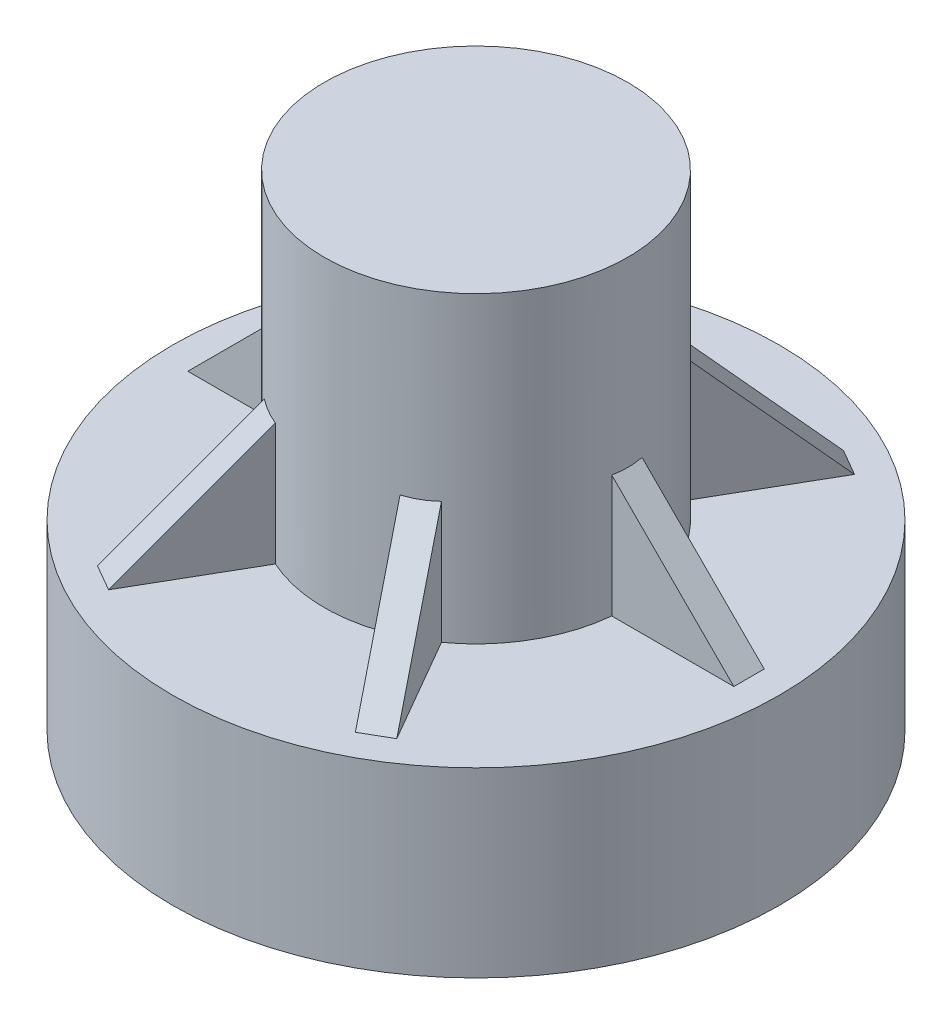
ISO-10303-21;
HEADER;
FILE_DESCRIPTION(('STEP AP214'),'2;1');
FILE_NAME('part.step','',(''),(''),'','','');
FILE_SCHEMA(('AUTOMOTIVE_DESIGN { 1 0 10303 214 1 1 1 1 }'));
ENDSEC;
DATA;
#1=APPLICATION_CONTEXT('core data for automotive mechanical design processes');
#2=APPLICATION_PROTOCOL_DEFINITION('international standard','automotive_design',2000,#1);
#3=PRODUCT_CONTEXT('',#1,'mechanical');
#4=PRODUCT('Part','Part','',(#3));
#5=PRODUCT_RELATED_PRODUCT_CATEGORY('part','',(#4));
#6=PRODUCT_DEFINITION_FORMATION('','',#4);
#7=PRODUCT_DEFINITION_CONTEXT('part definition',#1,'design');
#8=PRODUCT_DEFINITION('design','',#6,#7);
#9=PRODUCT_DEFINITION_SHAPE('','',#8);
#10=(LENGTH_UNIT() NAMED_UNIT(*) SI_UNIT(.MILLI.,.METRE.));
#11=(NAMED_UNIT(*) PLANE_ANGLE_UNIT() SI_UNIT($,.RADIAN.));
#12=(NAMED_UNIT(*) SI_UNIT($,.STERADIAN.) SOLID_ANGLE_UNIT());
#13=UNCERTAINTY_MEASURE_WITH_UNIT(LENGTH_MEASURE(1.E-05),#10,'distance_accuracy_value','');
#14=(GEOMETRIC_REPRESENTATION_CONTEXT(3) GLOBAL_UNCERTAINTY_ASSIGNED_CONTEXT((#13)) GLOBAL_UNIT_ASSIGNED_CONTEXT((#10,
#11,#12)) REPRESENTATION_CONTEXT('',''));
#15=CARTESIAN_POINT('',(0.,0.,0.));
#16=DIRECTION('',(0.,0.,1.));
#17=DIRECTION('',(1.,0.,0.));
#18=AXIS2_PLACEMENT_3D('',#15,#16,#17);
#19=CARTESIAN_POINT('',(24.9051040037769,73.20555272017,43.3012701892216));
#20=DIRECTION('',(-0.353553390593279,-0.707106781186551,-0.612372435695787));
#21=DIRECTION('',(0.353553390593283,-0.707106781186544,0.612372435695794));
#22=AXIS2_PLACEMENT_3D('',#19,#20,#21);
#23=PLANE('',#22);
#24=DIRECTION('',(0.353553390593283,-0.707106781186544,0.612372435695794));
#25=VECTOR('',#24,1.);
#26=CARTESIAN_POINT('',(20.5749769848547,73.20555272017,45.8012701892217));
#27=LINE('',#26,#25);
#28=CARTESIAN_POINT('',(20.4496629125202,73.4561808648391,45.584219849035));
#29=VERTEX_POINT('',#28);
#30=CARTESIAN_POINT('',(40.5749769848554,33.20555272017,80.4422863405994));
#31=VERTEX_POINT('',#30);
#32=EDGE_CURVE('E343',#29,#31,#27,.T.);
#33=ORIENTED_EDGE('',*,*,#32,.T.);
#34=DIRECTION('',(-0.866025403784433,0.,0.50000000000001));
#35=VECTOR('',#34,1.);
#36=CARTESIAN_POINT('',(44.9051040037775,33.20555272017,77.9422863405994));
#37=LINE('',#36,#35);
#38=CARTESIAN_POINT('',(49.2352310226997,33.20555272017,75.4422863405993));
#39=VERTEX_POINT('',#38);
#40=EDGE_CURVE('E47',#31,#39,#37,.F.);
#41=ORIENTED_EDGE('',*,*,#40,.T.);
#42=DIRECTION('',(0.353553390593283,-0.707106781186544,0.612372435695794));
#43=VECTOR('',#42,1.);
#44=CARTESIAN_POINT('',(29.235231022699,73.20555272017,40.8012701892216));
#45=LINE('',#44,#43);
#46=CARTESIAN_POINT('',(29.1099169503645,73.456180864839,40.5842198490349));
#47=VERTEX_POINT('',#46);
#48=EDGE_CURVE('E351',#47,#39,#45,.T.);
#49=ORIENTED_EDGE('',*,*,#48,.F.);
#50=CARTESIAN_POINT('',(-0.0948959962236216,123.20555272017,0.));
#51=DIRECTION('',(-0.353553390593279,-0.707106781186551,-0.612372435695787));
#52=DIRECTION('',(0.353553390593283,-0.707106781186544,0.612372435695794));
#53=AXIS2_PLACEMENT_3D('',#50,#51,#52);
#54=ELLIPSE('',#53,70.7106781186544,50.);
#55=EDGE_CURVE('E11',#29,#47,#54,.F.);
#56=ORIENTED_EDGE('',*,*,#55,.F.);
#57=EDGE_LOOP('',(#33,#41,#49,#56));
#58=FACE_BOUND('',#57,.T.);
#59=ADVANCED_FACE('F39',(#58),#23,.F.);
#60=CARTESIAN_POINT('',(4.23523102269854,53.20555272017,-2.50000000000005));
#61=DIRECTION('',(-0.866025403784433,0.,0.50000000000001));
#62=DIRECTION('',(0.50000000000001,0.,0.866025403784433));
#63=AXIS2_PLACEMENT_3D('',#60,#61,#62);
#64=PLANE('',#63);
#65=DIRECTION('',(0.50000000000001,0.,0.866025403784433));
#66=VECTOR('',#65,1.);
#67=CARTESIAN_POINT('',(4.23523102269854,33.20555272017,-2.50000000000005));
#68=LINE('',#67,#66);
#69=CARTESIAN_POINT('',(29.1099169503645,33.20555272017,40.5842198490349));
#70=VERTEX_POINT('',#69);
#71=EDGE_CURVE('E54',#70,#39,#68,.T.);
#72=ORIENTED_EDGE('',*,*,#71,.F.);
#73=DIRECTION('',(0.,-1.,0.));
#74=VECTOR('',#73,1.);
#75=CARTESIAN_POINT('',(29.1099169503645,133.20555272017,40.5842198490349));
#76=LINE('',#75,#74);
#77=EDGE_CURVE('E60',#70,#47,#76,.F.);
#78=ORIENTED_EDGE('',*,*,#77,.T.);
#79=ORIENTED_EDGE('',*,*,#48,.T.);
#80=EDGE_LOOP('',(#72,#78,#79));
#81=FACE_BOUND('',#80,.T.);
#82=ADVANCED_FACE('F382',(#81),#64,.F.);
#83=CARTESIAN_POINT('',(-4.42502301514579,53.20555272017,2.50000000000005));
#84=DIRECTION('',(-0.866025403784433,0.,0.50000000000001));
#85=DIRECTION('',(0.50000000000001,0.,0.866025403784433));
#86=AXIS2_PLACEMENT_3D('',#83,#84,#85);
#87=PLANE('',#86);
#88=DIRECTION('',(0.,-1.,0.));
#89=VECTOR('',#88,1.);
#90=CARTESIAN_POINT('',(20.4496629125202,133.20555272017,45.584219849035));
#91=LINE('',#90,#89);
#92=CARTESIAN_POINT('',(20.4496629125202,33.20555272017,45.584219849035));
#93=VERTEX_POINT('',#92);
#94=EDGE_CURVE('E337',#93,#29,#91,.F.);
#95=ORIENTED_EDGE('',*,*,#94,.F.);
#96=DIRECTION('',(0.50000000000001,0.,0.866025403784433));
#97=VECTOR('',#96,1.);
#98=CARTESIAN_POINT('',(-4.42502301514579,33.20555272017,2.50000000000005));
#99=LINE('',#98,#97);
#100=EDGE_CURVE('E340',#93,#31,#99,.T.);
#101=ORIENTED_EDGE('',*,*,#100,.T.);
#102=ORIENTED_EDGE('',*,*,#32,.F.);
#103=EDGE_LOOP('',(#95,#101,#102));
#104=FACE_BOUND('',#103,.T.);
#105=ADVANCED_FACE('F364',(#104),#87,.T.);
#106=CARTESIAN_POINT('',(-25.0948959962232,73.20555272017,43.3012701892222));
#107=DIRECTION('',(0.353553390593266,-0.707106781186551,-0.612372435695794));
#108=DIRECTION('',(-0.35355339059327,-0.707106781186544,0.612372435695801));
#109=AXIS2_PLACEMENT_3D('',#106,#107,#108);
#110=PLANE('',#109);
#111=DIRECTION('',(-0.35355339059327,-0.707106781186544,0.612372435695801));
#112=VECTOR('',#111,1.);
#113=CARTESIAN_POINT('',(-29.4250230151454,73.20555272017,40.8012701892222));
#114=LINE('',#113,#112);
#115=CARTESIAN_POINT('',(-29.2997089428109,73.4561808648391,40.5842198490355));
#116=VERTEX_POINT('',#115);
#117=CARTESIAN_POINT('',(-49.4250230151453,33.20555272017,75.4422863406003));
#118=VERTEX_POINT('',#117);
#119=EDGE_CURVE('E315',#116,#118,#114,.T.);
#120=ORIENTED_EDGE('',*,*,#119,.T.);
#121=DIRECTION('',(-0.866025403784443,0.,-0.499999999999992));
#122=VECTOR('',#121,1.);
#123=CARTESIAN_POINT('',(-45.0948959962231,33.20555272017,77.9422863406003));
#124=LINE('',#123,#122);
#125=CARTESIAN_POINT('',(-40.7647689773009,33.20555272017,80.4422863406003));
#126=VERTEX_POINT('',#125);
#127=EDGE_CURVE('E329',#118,#126,#124,.F.);
#128=ORIENTED_EDGE('',*,*,#127,.T.);
#129=DIRECTION('',(-0.35355339059327,-0.707106781186544,0.612372435695801));
#130=VECTOR('',#129,1.);
#131=CARTESIAN_POINT('',(-20.764768977301,73.20555272017,45.8012701892221));
#132=LINE('',#131,#130);
#133=CARTESIAN_POINT('',(-20.6394549049665,73.456180864839,45.5842198490354));
#134=VERTEX_POINT('',#133);
#135=EDGE_CURVE('E325',#134,#126,#132,.T.);
#136=ORIENTED_EDGE('',*,*,#135,.F.);
#137=CARTESIAN_POINT('',(-0.0948959962236216,123.20555272017,0.));
#138=DIRECTION('',(0.353553390593266,-0.707106781186551,-0.612372435695794));
#139=DIRECTION('',(-0.35355339059327,-0.707106781186544,0.612372435695801));
#140=AXIS2_PLACEMENT_3D('',#137,#138,#139);
#141=ELLIPSE('',#140,70.7106781186544,50.);
#142=EDGE_CURVE('E333',#116,#134,#141,.F.);
#143=ORIENTED_EDGE('',*,*,#142,.F.);
#144=EDGE_LOOP('',(#120,#128,#136,#143));
#145=FACE_BOUND('',#144,.T.);
#146=ADVANCED_FACE('F389',(#145),#110,.F.);
#147=CARTESIAN_POINT('',(4.23523102269859,53.20555272017,2.49999999999996));
#148=DIRECTION('',(-0.866025403784443,0.,-0.499999999999992));
#149=DIRECTION('',(-0.499999999999992,0.,0.866025403784443));
#150=AXIS2_PLACEMENT_3D('',#147,#148,#149);
#151=PLANE('',#150);
#152=DIRECTION('',(-0.499999999999992,0.,0.866025403784443));
#153=VECTOR('',#152,1.);
#154=CARTESIAN_POINT('',(4.23523102269859,33.20555272017,2.49999999999996));
#155=LINE('',#154,#153);
#156=CARTESIAN_POINT('',(-20.6394549049665,33.20555272017,45.5842198490354));
#157=VERTEX_POINT('',#156);
#158=EDGE_CURVE('E319',#157,#126,#155,.T.);
#159=ORIENTED_EDGE('',*,*,#158,.F.);
#160=DIRECTION('',(0.,-1.,0.));
#161=VECTOR('',#160,1.);
#162=CARTESIAN_POINT('',(-20.6394549049665,133.20555272017,45.5842198490354));
#163=LINE('',#162,#161);
#164=EDGE_CURVE('E322',#157,#134,#163,.F.);
#165=ORIENTED_EDGE('',*,*,#164,.T.);
#166=ORIENTED_EDGE('',*,*,#135,.T.);
#167=EDGE_LOOP('',(#159,#165,#166));
#168=FACE_BOUND('',#167,.T.);
#169=ADVANCED_FACE('F394',(#168),#151,.F.);
#170=CARTESIAN_POINT('',(-4.42502301514584,53.20555272017,-2.49999999999996));
#171=DIRECTION('',(-0.866025403784443,0.,-0.499999999999992));
#172=DIRECTION('',(-0.499999999999992,0.,0.866025403784443));
#173=AXIS2_PLACEMENT_3D('',#170,#171,#172);
#174=PLANE('',#173);
#175=DIRECTION('',(0.,-1.,0.));
#176=VECTOR('',#175,1.);
#177=CARTESIAN_POINT('',(-29.2997089428109,133.20555272017,40.5842198490355));
#178=LINE('',#177,#176);
#179=CARTESIAN_POINT('',(-29.2997089428109,33.20555272017,40.5842198490355));
#180=VERTEX_POINT('',#179);
#181=EDGE_CURVE('E309',#180,#116,#178,.F.);
#182=ORIENTED_EDGE('',*,*,#181,.F.);
#183=DIRECTION('',(-0.499999999999992,0.,0.866025403784443));
#184=VECTOR('',#183,1.);
#185=CARTESIAN_POINT('',(-4.42502301514584,33.20555272017,-2.49999999999996));
#186=LINE('',#185,#184);
#187=EDGE_CURVE('E312',#180,#118,#186,.T.);
#188=ORIENTED_EDGE('',*,*,#187,.T.);
#189=ORIENTED_EDGE('',*,*,#119,.F.);
#190=EDGE_LOOP('',(#182,#188,#189));
#191=FACE_BOUND('',#190,.T.);
#192=ADVANCED_FACE('F398',(#191),#174,.T.);
#193=CARTESIAN_POINT('',(-50.0948959962236,73.20555272017,0.));
#194=DIRECTION('',(0.707106781186544,-0.707106781186551,0.));
#195=DIRECTION('',(-0.707106781186551,-0.707106781186544,0.));
#196=AXIS2_PLACEMENT_3D('',#193,#194,#195);
#197=PLANE('',#196);
#198=DIRECTION('',(-0.707106781186551,-0.707106781186544,0.));
#199=VECTOR('',#198,1.);
#200=CARTESIAN_POINT('',(-50.0948959962236,73.20555272017,-5.));
#201=LINE('',#200,#199);
#202=CARTESIAN_POINT('',(-49.8442678515546,73.4561808648391,-5.));
#203=VERTEX_POINT('',#202);
#204=CARTESIAN_POINT('',(-90.0948959962241,33.20555272017,-5.));
#205=VERTEX_POINT('',#204);
#206=EDGE_CURVE('E286',#203,#205,#201,.T.);
#207=ORIENTED_EDGE('',*,*,#206,.T.);
#208=DIRECTION('',(0.,0.,-1.));
#209=VECTOR('',#208,1.);
#210=CARTESIAN_POINT('',(-90.0948959962241,33.20555272017,0.));
#211=LINE('',#210,#209);
#212=CARTESIAN_POINT('',(-90.0948959962241,33.20555272017,5.));
#213=VERTEX_POINT('',#212);
#214=EDGE_CURVE('E300',#205,#213,#211,.F.);
#215=ORIENTED_EDGE('',*,*,#214,.T.);
#216=DIRECTION('',(-0.707106781186551,-0.707106781186544,0.));
#217=VECTOR('',#216,1.);
#218=CARTESIAN_POINT('',(-50.0948959962236,73.20555272017,5.));
#219=LINE('',#218,#217);
#220=CARTESIAN_POINT('',(-49.8442678515546,73.456180864839,5.));
#221=VERTEX_POINT('',#220);
#222=EDGE_CURVE('E296',#221,#213,#219,.T.);
#223=ORIENTED_EDGE('',*,*,#222,.F.);
#224=CARTESIAN_POINT('',(-0.0948959962236216,123.20555272017,0.));
#225=DIRECTION('',(0.707106781186544,-0.707106781186551,0.));
#226=DIRECTION('',(-0.707106781186551,-0.707106781186544,0.));
#227=AXIS2_PLACEMENT_3D('',#224,#225,#226);
#228=ELLIPSE('',#227,70.7106781186544,50.);
#229=EDGE_CURVE('E304',#203,#221,#228,.F.);
#230=ORIENTED_EDGE('',*,*,#229,.F.);
#231=EDGE_LOOP('',(#207,#215,#223,#230));
#232=FACE_BOUND('',#231,.T.);
#233=ADVANCED_FACE('F402',(#232),#197,.F.);
#234=CARTESIAN_POINT('',(-0.0948959962236216,53.20555272017,5.));
#235=DIRECTION('',(0.,0.,-1.));
#236=DIRECTION('',(-1.,0.,0.));
#237=AXIS2_PLACEMENT_3D('',#234,#235,#236);
#238=PLANE('',#237);
#239=DIRECTION('',(-1.,0.,0.));
#240=VECTOR('',#239,1.);
#241=CARTESIAN_POINT('',(-0.0948959962236216,33.20555272017,5.));
#242=LINE('',#241,#240);
#243=CARTESIAN_POINT('',(-49.8442678515546,33.20555272017,5.));
#244=VERTEX_POINT('',#243);
#245=EDGE_CURVE('E290',#244,#213,#242,.T.);
#246=ORIENTED_EDGE('',*,*,#245,.F.);
#247=DIRECTION('',(0.,-1.,0.));
#248=VECTOR('',#247,1.);
#249=CARTESIAN_POINT('',(-49.8442678515546,133.20555272017,5.));
#250=LINE('',#249,#248);
#251=EDGE_CURVE('E293',#244,#221,#250,.F.);
#252=ORIENTED_EDGE('',*,*,#251,.T.);
#253=ORIENTED_EDGE('',*,*,#222,.T.);
#254=EDGE_LOOP('',(#246,#252,#253));
#255=FACE_BOUND('',#254,.T.);
#256=ADVANCED_FACE('F406',(#255),#238,.F.);
#257=CARTESIAN_POINT('',(-0.0948959962236216,53.20555272017,-5.));
#258=DIRECTION('',(0.,0.,-1.));
#259=DIRECTION('',(-1.,0.,0.));
#260=AXIS2_PLACEMENT_3D('',#257,#258,#259);
#261=PLANE('',#260);
#262=DIRECTION('',(0.,-1.,0.));
#263=VECTOR('',#262,1.);
#264=CARTESIAN_POINT('',(-49.8442678515546,133.20555272017,-5.));
#265=LINE('',#264,#263);
#266=CARTESIAN_POINT('',(-49.8442678515546,33.20555272017,-5.));
#267=VERTEX_POINT('',#266);
#268=EDGE_CURVE('E280',#267,#203,#265,.F.);
#269=ORIENTED_EDGE('',*,*,#268,.F.);
#270=DIRECTION('',(-1.,0.,0.));
#271=VECTOR('',#270,1.);
#272=CARTESIAN_POINT('',(-0.0948959962236216,33.20555272017,-5.));
#273=LINE('',#272,#271);
#274=EDGE_CURVE('E283',#267,#205,#273,.T.);
#275=ORIENTED_EDGE('',*,*,#274,.T.);
#276=ORIENTED_EDGE('',*,*,#206,.F.);
#277=EDGE_LOOP('',(#269,#275,#276));
#278=FACE_BOUND('',#277,.T.);
#279=ADVANCED_FACE('F410',(#278),#261,.T.);
#280=CARTESIAN_POINT('',(-25.0948959962238,73.20555272017,-43.3012701892218));
#281=DIRECTION('',(0.353553390593275,-0.707106781186551,0.61237243569579));
#282=DIRECTION('',(-0.353553390593279,-0.707106781186544,-0.612372435695796));
#283=AXIS2_PLACEMENT_3D('',#280,#281,#282);
#284=PLANE('',#283);
#285=DIRECTION('',(-0.353553390593279,-0.707106781186544,-0.612372435695796));
#286=VECTOR('',#285,1.);
#287=CARTESIAN_POINT('',(-20.7647689773016,73.20555272017,-45.8012701892219));
#288=LINE('',#287,#286);
#289=CARTESIAN_POINT('',(-20.6394549049671,73.4561808648391,-45.5842198490351));
#290=VERTEX_POINT('',#289);
#291=CARTESIAN_POINT('',(-40.764768977302,33.20555272017,-80.4422863405997));
#292=VERTEX_POINT('',#291);
#293=EDGE_CURVE('E257',#290,#292,#288,.T.);
#294=ORIENTED_EDGE('',*,*,#293,.T.);
#295=DIRECTION('',(0.866025403784436,0.,-0.500000000000004));
#296=VECTOR('',#295,1.);
#297=CARTESIAN_POINT('',(-45.0948959962242,33.20555272017,-77.9422863405997));
#298=LINE('',#297,#296);
#299=CARTESIAN_POINT('',(-49.4250230151464,33.20555272017,-75.4422863405997));
#300=VERTEX_POINT('',#299);
#301=EDGE_CURVE('E271',#292,#300,#298,.F.);
#302=ORIENTED_EDGE('',*,*,#301,.T.);
#303=DIRECTION('',(-0.353553390593279,-0.707106781186544,-0.612372435695796));
#304=VECTOR('',#303,1.);
#305=CARTESIAN_POINT('',(-29.425023015146,73.20555272017,-40.8012701892218));
#306=LINE('',#305,#304);
#307=CARTESIAN_POINT('',(-29.2997089428115,73.456180864839,-40.5842198490351));
#308=VERTEX_POINT('',#307);
#309=EDGE_CURVE('E267',#308,#300,#306,.T.);
#310=ORIENTED_EDGE('',*,*,#309,.F.);
#311=CARTESIAN_POINT('',(-0.0948959962236216,123.20555272017,0.));
#312=DIRECTION('',(0.353553390593275,-0.707106781186551,0.61237243569579));
#313=DIRECTION('',(-0.353553390593279,-0.707106781186544,-0.612372435695796));
#314=AXIS2_PLACEMENT_3D('',#311,#312,#313);
#315=ELLIPSE('',#314,70.7106781186544,50.);
#316=EDGE_CURVE('E275',#290,#308,#315,.F.);
#317=ORIENTED_EDGE('',*,*,#316,.F.);
#318=EDGE_LOOP('',(#294,#302,#310,#317));
#319=FACE_BOUND('',#318,.T.);
#320=ADVANCED_FACE('F414',(#319),#284,.F.);
#321=CARTESIAN_POINT('',(-4.4250230151458,53.20555272017,2.50000000000002));
#322=DIRECTION('',(0.866025403784436,0.,-0.500000000000004));
#323=DIRECTION('',(-0.500000000000004,0.,-0.866025403784436));
#324=AXIS2_PLACEMENT_3D('',#321,#322,#323);
#325=PLANE('',#324);
#326=DIRECTION('',(-0.500000000000004,0.,-0.866025403784436));
#327=VECTOR('',#326,1.);
#328=CARTESIAN_POINT('',(-4.4250230151458,33.20555272017,2.50000000000002));
#329=LINE('',#328,#327);
#330=CARTESIAN_POINT('',(-29.2997089428115,33.20555272017,-40.5842198490351));
#331=VERTEX_POINT('',#330);
#332=EDGE_CURVE('E261',#331,#300,#329,.T.);
#333=ORIENTED_EDGE('',*,*,#332,.F.);
#334=DIRECTION('',(0.,-1.,0.));
#335=VECTOR('',#334,1.);
#336=CARTESIAN_POINT('',(-29.2997089428115,133.20555272017,-40.5842198490351));
#337=LINE('',#336,#335);
#338=EDGE_CURVE('E264',#331,#308,#337,.F.);
#339=ORIENTED_EDGE('',*,*,#338,.T.);
#340=ORIENTED_EDGE('',*,*,#309,.T.);
#341=EDGE_LOOP('',(#333,#339,#340));
#342=FACE_BOUND('',#341,.T.);
#343=ADVANCED_FACE('F418',(#342),#325,.F.);
#344=CARTESIAN_POINT('',(4.23523102269856,53.20555272017,-2.50000000000002));
#345=DIRECTION('',(0.866025403784436,0.,-0.500000000000004));
#346=DIRECTION('',(-0.500000000000004,0.,-0.866025403784436));
#347=AXIS2_PLACEMENT_3D('',#344,#345,#346);
#348=PLANE('',#347);
#349=DIRECTION('',(0.,-1.,0.));
#350=VECTOR('',#349,1.);
#351=CARTESIAN_POINT('',(-20.6394549049671,133.20555272017,-45.5842198490351));
#352=LINE('',#351,#350);
#353=CARTESIAN_POINT('',(-20.6394549049671,33.20555272017,-45.5842198490351));
#354=VERTEX_POINT('',#353);
#355=EDGE_CURVE('E251',#354,#290,#352,.F.);
#356=ORIENTED_EDGE('',*,*,#355,.F.);
#357=DIRECTION('',(-0.500000000000004,0.,-0.866025403784436));
#358=VECTOR('',#357,1.);
#359=CARTESIAN_POINT('',(4.23523102269856,33.20555272017,-2.50000000000002));
#360=LINE('',#359,#358);
#361=EDGE_CURVE('E254',#354,#292,#360,.T.);
#362=ORIENTED_EDGE('',*,*,#361,.T.);
#363=ORIENTED_EDGE('',*,*,#293,.F.);
#364=EDGE_LOOP('',(#356,#362,#363));
#365=FACE_BOUND('',#364,.T.);
#366=ADVANCED_FACE('F422',(#365),#348,.T.);
#367=CARTESIAN_POINT('',(24.9051040037763,73.20555272017,-43.301270189222));
#368=DIRECTION('',(-0.35355339059327,-0.707106781186551,0.612372435695792));
#369=DIRECTION('',(0.353553390593274,-0.707106781186544,-0.612372435695799));
#370=AXIS2_PLACEMENT_3D('',#367,#368,#369);
#371=PLANE('',#370);
#372=DIRECTION('',(0.353553390593274,-0.707106781186544,-0.612372435695799));
#373=VECTOR('',#372,1.);
#374=CARTESIAN_POINT('',(29.2352310226985,73.20555272017,-40.801270189222));
#375=LINE('',#374,#373);
#376=CARTESIAN_POINT('',(29.109916950364,73.4561808648391,-40.5842198490353));
#377=VERTEX_POINT('',#376);
#378=CARTESIAN_POINT('',(49.2352310226986,33.20555272017,-75.4422863406));
#379=VERTEX_POINT('',#378);
#380=EDGE_CURVE('E228',#377,#379,#375,.T.);
#381=ORIENTED_EDGE('',*,*,#380,.T.);
#382=DIRECTION('',(0.86602540378444,0.,0.499999999999998));
#383=VECTOR('',#382,1.);
#384=CARTESIAN_POINT('',(44.9051040037764,33.20555272017,-77.9422863406));
#385=LINE('',#384,#383);
#386=CARTESIAN_POINT('',(40.5749769848542,33.20555272017,-80.4422863406));
#387=VERTEX_POINT('',#386);
#388=EDGE_CURVE('E242',#379,#387,#385,.F.);
#389=ORIENTED_EDGE('',*,*,#388,.T.);
#390=DIRECTION('',(0.353553390593274,-0.707106781186544,-0.612372435695799));
#391=VECTOR('',#390,1.);
#392=CARTESIAN_POINT('',(20.5749769848541,73.20555272017,-45.801270189222));
#393=LINE('',#392,#391);
#394=CARTESIAN_POINT('',(20.4496629125196,73.456180864839,-45.5842198490353));
#395=VERTEX_POINT('',#394);
#396=EDGE_CURVE('E238',#395,#387,#393,.T.);
#397=ORIENTED_EDGE('',*,*,#396,.F.);
#398=CARTESIAN_POINT('',(-0.0948959962236216,123.20555272017,0.));
#399=DIRECTION('',(-0.35355339059327,-0.707106781186551,0.612372435695792));
#400=DIRECTION('',(0.353553390593274,-0.707106781186544,-0.612372435695799));
#401=AXIS2_PLACEMENT_3D('',#398,#399,#400);
#402=ELLIPSE('',#401,70.7106781186544,50.);
#403=EDGE_CURVE('E246',#377,#395,#402,.F.);
#404=ORIENTED_EDGE('',*,*,#403,.F.);
#405=EDGE_LOOP('',(#381,#389,#397,#404));
#406=FACE_BOUND('',#405,.T.);
#407=ADVANCED_FACE('F426',(#406),#371,.F.);
#408=CARTESIAN_POINT('',(-4.42502301514582,53.20555272017,-2.49999999999999));
#409=DIRECTION('',(0.86602540378444,0.,0.499999999999998));
#410=DIRECTION('',(0.499999999999998,0.,-0.86602540378444));
#411=AXIS2_PLACEMENT_3D('',#408,#409,#410);
#412=PLANE('',#411);
#413=DIRECTION('',(0.499999999999998,0.,-0.86602540378444));
#414=VECTOR('',#413,1.);
#415=CARTESIAN_POINT('',(-4.42502301514582,33.20555272017,-2.49999999999999));
#416=LINE('',#415,#414);
#417=CARTESIAN_POINT('',(20.4496629125196,33.20555272017,-45.5842198490353));
#418=VERTEX_POINT('',#417);
#419=EDGE_CURVE('E232',#418,#387,#416,.T.);
#420=ORIENTED_EDGE('',*,*,#419,.F.);
#421=DIRECTION('',(0.,-1.,0.));
#422=VECTOR('',#421,1.);
#423=CARTESIAN_POINT('',(20.4496629125196,133.20555272017,-45.5842198490353));
#424=LINE('',#423,#422);
#425=EDGE_CURVE('E235',#418,#395,#424,.F.);
#426=ORIENTED_EDGE('',*,*,#425,.T.);
#427=ORIENTED_EDGE('',*,*,#396,.T.);
#428=EDGE_LOOP('',(#420,#426,#427));
#429=FACE_BOUND('',#428,.T.);
#430=ADVANCED_FACE('F430',(#429),#412,.F.);
#431=CARTESIAN_POINT('',(4.23523102269858,53.20555272017,2.49999999999999));
#432=DIRECTION('',(0.86602540378444,0.,0.499999999999998));
#433=DIRECTION('',(0.499999999999998,0.,-0.86602540378444));
#434=AXIS2_PLACEMENT_3D('',#431,#432,#433);
#435=PLANE('',#434);
#436=DIRECTION('',(0.,-1.,0.));
#437=VECTOR('',#436,1.);
#438=CARTESIAN_POINT('',(29.109916950364,133.20555272017,-40.5842198490353));
#439=LINE('',#438,#437);
#440=CARTESIAN_POINT('',(29.109916950364,33.20555272017,-40.5842198490353));
#441=VERTEX_POINT('',#440);
#442=EDGE_CURVE('E222',#441,#377,#439,.F.);
#443=ORIENTED_EDGE('',*,*,#442,.F.);
#444=DIRECTION('',(0.499999999999998,0.,-0.86602540378444));
#445=VECTOR('',#444,1.);
#446=CARTESIAN_POINT('',(4.23523102269858,33.20555272017,2.49999999999999));
#447=LINE('',#446,#445);
#448=EDGE_CURVE('E225',#441,#379,#447,.T.);
#449=ORIENTED_EDGE('',*,*,#448,.T.);
#450=ORIENTED_EDGE('',*,*,#380,.F.);
#451=EDGE_LOOP('',(#443,#449,#450));
#452=FACE_BOUND('',#451,.T.);
#453=ADVANCED_FACE('F434',(#452),#435,.T.);
#454=CARTESIAN_POINT('',(-0.0948959962236216,33.20555272017,0.));
#455=DIRECTION('',(0.,-1.,0.));
#456=DIRECTION('',(0.,0.,-1.));
#457=AXIS2_PLACEMENT_3D('',#454,#455,#456);
#458=CYLINDRICAL_SURFACE('',#457,100.);
#459=CARTESIAN_POINT('',(-0.0948959962236216,-26.79444727983,0.));
#460=DIRECTION('',(0.,1.,0.));
#461=DIRECTION('',(0.,0.,1.));
#462=AXIS2_PLACEMENT_3D('',#459,#460,#461);
#463=CIRCLE('',#462,100.);
#464=CARTESIAN_POINT('',(-0.0948959962236216,-26.79444727983,100.));
#465=VERTEX_POINT('',#464);
#466=EDGE_CURVE('E210',#465,#465,#463,.T.);
#467=ORIENTED_EDGE('',*,*,#466,.T.);
#468=EDGE_LOOP('',(#467));
#469=FACE_BOUND('',#468,.T.);
#470=CARTESIAN_POINT('',(-0.0948959962236216,33.20555272017,0.));
#471=DIRECTION('',(0.,1.,0.));
#472=DIRECTION('',(0.,0.,1.));
#473=AXIS2_PLACEMENT_3D('',#470,#471,#472);
#474=CIRCLE('',#473,100.);
#475=CARTESIAN_POINT('',(-0.0948959962236216,33.20555272017,100.));
#476=VERTEX_POINT('',#475);
#477=EDGE_CURVE('E215',#476,#476,#474,.T.);
#478=ORIENTED_EDGE('',*,*,#477,.F.);
#479=EDGE_LOOP('',(#478));
#480=FACE_BOUND('',#479,.T.);
#481=ADVANCED_FACE('F438',(#469,#480),#458,.T.);
#482=CARTESIAN_POINT('',(-0.0948959962236216,33.20555272017,0.));
#483=DIRECTION('',(0.,1.,0.));
#484=DIRECTION('',(0.,0.,1.));
#485=AXIS2_PLACEMENT_3D('',#482,#483,#484);
#486=PLANE('',#485);
#487=CARTESIAN_POINT('',(-0.0948959962236216,33.20555272017,0.));
#488=DIRECTION('',(0.,1.,0.));
#489=DIRECTION('',(0.,0.,1.));
#490=AXIS2_PLACEMENT_3D('',#487,#488,#489);
#491=CIRCLE('',#490,50.);
#492=EDGE_CURVE('E308',#157,#93,#491,.T.);
#493=ORIENTED_EDGE('',*,*,#492,.F.);
#494=ORIENTED_EDGE('',*,*,#158,.T.);
#495=ORIENTED_EDGE('',*,*,#127,.F.);
#496=ORIENTED_EDGE('',*,*,#187,.F.);
#497=EDGE_CURVE('E279',#244,#180,#491,.T.);
#498=ORIENTED_EDGE('',*,*,#497,.F.);
#499=ORIENTED_EDGE('',*,*,#245,.T.);
#500=ORIENTED_EDGE('',*,*,#214,.F.);
#501=ORIENTED_EDGE('',*,*,#274,.F.);
#502=EDGE_CURVE('E250',#331,#267,#491,.T.);
#503=ORIENTED_EDGE('',*,*,#502,.F.);
#504=ORIENTED_EDGE('',*,*,#332,.T.);
#505=ORIENTED_EDGE('',*,*,#301,.F.);
#506=ORIENTED_EDGE('',*,*,#361,.F.);
#507=EDGE_CURVE('E214',#418,#354,#491,.T.);
#508=ORIENTED_EDGE('',*,*,#507,.F.);
#509=ORIENTED_EDGE('',*,*,#419,.T.);
#510=ORIENTED_EDGE('',*,*,#388,.F.);
#511=ORIENTED_EDGE('',*,*,#448,.F.);
#512=CARTESIAN_POINT('',(49.6544758591074,33.20555272017,-5.));
#513=VERTEX_POINT('',#512);
#514=EDGE_CURVE('E205',#513,#441,#491,.T.);
#515=ORIENTED_EDGE('',*,*,#514,.F.);
#516=DIRECTION('',(1.,0.,0.));
#517=VECTOR('',#516,1.);
#518=CARTESIAN_POINT('',(-0.0948959962236216,33.20555272017,-5.));
#519=LINE('',#518,#517);
#520=CARTESIAN_POINT('',(89.9051040037768,33.20555272017,-5.));
#521=VERTEX_POINT('',#520);
#522=EDGE_CURVE('E185',#513,#521,#519,.T.);
#523=ORIENTED_EDGE('',*,*,#522,.T.);
#524=DIRECTION('',(0.,0.,1.));
#525=VECTOR('',#524,1.);
#526=CARTESIAN_POINT('',(89.9051040037768,33.20555272017,0.));
#527=LINE('',#526,#525);
#528=CARTESIAN_POINT('',(89.9051040037768,33.20555272017,5.));
#529=VERTEX_POINT('',#528);
#530=EDGE_CURVE('E177',#529,#521,#527,.F.);
#531=ORIENTED_EDGE('',*,*,#530,.F.);
#532=DIRECTION('',(1.,0.,0.));
#533=VECTOR('',#532,1.);
#534=CARTESIAN_POINT('',(-0.0948959962236216,33.20555272017,5.));
#535=LINE('',#534,#533);
#536=CARTESIAN_POINT('',(49.6544758591074,33.20555272017,5.));
#537=VERTEX_POINT('',#536);
#538=EDGE_CURVE('E178',#537,#529,#535,.T.);
#539=ORIENTED_EDGE('',*,*,#538,.F.);
#540=EDGE_CURVE('E213',#70,#537,#491,.T.);
#541=ORIENTED_EDGE('',*,*,#540,.F.);
#542=ORIENTED_EDGE('',*,*,#71,.T.);
#543=ORIENTED_EDGE('',*,*,#40,.F.);
#544=ORIENTED_EDGE('',*,*,#100,.F.);
#545=EDGE_LOOP('',(#493,#494,#495,#496,#498,#499,#500,#501,#503,#504,#505,#506,#508,#509,#510,
#511,#515,#523,#531,#539,#541,#542,#543,#544));
#546=FACE_BOUND('',#545,.T.);
#547=ORIENTED_EDGE('',*,*,#477,.T.);
#548=EDGE_LOOP('',(#547));
#549=FACE_BOUND('',#548,.T.);
#550=ADVANCED_FACE('F359',(#546,#549),#486,.T.);
#551=CARTESIAN_POINT('',(-0.0948959962236216,-26.79444727983,0.));
#552=DIRECTION('',(0.,1.,0.));
#553=DIRECTION('',(0.,0.,1.));
#554=AXIS2_PLACEMENT_3D('',#551,#552,#553);
#555=PLANE('',#554);
#556=ORIENTED_EDGE('',*,*,#466,.F.);
#557=EDGE_LOOP('',(#556));
#558=FACE_BOUND('',#557,.T.);
#559=ADVANCED_FACE('F443',(#558),#555,.F.);
#560=CARTESIAN_POINT('',(-0.0948959962236216,133.20555272017,0.));
#561=DIRECTION('',(0.,-1.,0.));
#562=DIRECTION('',(0.,0.,-1.));
#563=AXIS2_PLACEMENT_3D('',#560,#561,#562);
#564=CYLINDRICAL_SURFACE('',#563,50.);
#565=ORIENTED_EDGE('',*,*,#492,.T.);
#566=ORIENTED_EDGE('',*,*,#94,.T.);
#567=ORIENTED_EDGE('',*,*,#55,.T.);
#568=ORIENTED_EDGE('',*,*,#77,.F.);
#569=ORIENTED_EDGE('',*,*,#540,.T.);
#570=DIRECTION('',(0.,-1.,0.));
#571=VECTOR('',#570,1.);
#572=CARTESIAN_POINT('',(49.6544758591074,133.20555272017,5.));
#573=LINE('',#572,#571);
#574=CARTESIAN_POINT('',(49.6544758591074,73.4561808648391,5.));
#575=VERTEX_POINT('',#574);
#576=EDGE_CURVE('E171',#537,#575,#573,.F.);
#577=ORIENTED_EDGE('',*,*,#576,.T.);
#578=CARTESIAN_POINT('',(-0.0948959962236216,123.20555272017,0.));
#579=DIRECTION('',(-0.707106781186544,-0.707106781186551,0.));
#580=DIRECTION('',(0.707106781186551,-0.707106781186544,0.));
#581=AXIS2_PLACEMENT_3D('',#578,#579,#580);
#582=ELLIPSE('',#581,70.7106781186544,50.);
#583=CARTESIAN_POINT('',(49.6544758591074,73.456180864839,-5.));
#584=VERTEX_POINT('',#583);
#585=EDGE_CURVE('E164',#575,#584,#582,.F.);
#586=ORIENTED_EDGE('',*,*,#585,.T.);
#587=DIRECTION('',(0.,-1.,0.));
#588=VECTOR('',#587,1.);
#589=CARTESIAN_POINT('',(49.6544758591074,133.20555272017,-5.));
#590=LINE('',#589,#588);
#591=EDGE_CURVE('E168',#513,#584,#590,.F.);
#592=ORIENTED_EDGE('',*,*,#591,.F.);
#593=ORIENTED_EDGE('',*,*,#514,.T.);
#594=ORIENTED_EDGE('',*,*,#442,.T.);
#595=ORIENTED_EDGE('',*,*,#403,.T.);
#596=ORIENTED_EDGE('',*,*,#425,.F.);
#597=ORIENTED_EDGE('',*,*,#507,.T.);
#598=ORIENTED_EDGE('',*,*,#355,.T.);
#599=ORIENTED_EDGE('',*,*,#316,.T.);
#600=ORIENTED_EDGE('',*,*,#338,.F.);
#601=ORIENTED_EDGE('',*,*,#502,.T.);
#602=ORIENTED_EDGE('',*,*,#268,.T.);
#603=ORIENTED_EDGE('',*,*,#229,.T.);
#604=ORIENTED_EDGE('',*,*,#251,.F.);
#605=ORIENTED_EDGE('',*,*,#497,.T.);
#606=ORIENTED_EDGE('',*,*,#181,.T.);
#607=ORIENTED_EDGE('',*,*,#142,.T.);
#608=ORIENTED_EDGE('',*,*,#164,.F.);
#609=EDGE_LOOP('',(#565,#566,#567,#568,#569,#577,#586,#592,#593,#594,#595,#596,#597,#598,#599,
#600,#601,#602,#603,#604,#605,#606,#607,#608));
#610=FACE_BOUND('',#609,.T.);
#611=CARTESIAN_POINT('',(-0.0948959962236216,133.20555272017,0.));
#612=DIRECTION('',(0.,1.,0.));
#613=DIRECTION('',(0.,0.,1.));
#614=AXIS2_PLACEMENT_3D('',#611,#612,#613);
#615=CIRCLE('',#614,50.);
#616=CARTESIAN_POINT('',(-0.0948959962236216,133.20555272017,50.));
#617=VERTEX_POINT('',#616);
#618=EDGE_CURVE('E206',#617,#617,#615,.T.);
#619=ORIENTED_EDGE('',*,*,#618,.F.);
#620=EDGE_LOOP('',(#619));
#621=FACE_BOUND('',#620,.T.);
#622=ADVANCED_FACE('F166',(#610,#621),#564,.T.);
#623=CARTESIAN_POINT('',(-0.0948959962236216,133.20555272017,0.));
#624=DIRECTION('',(0.,1.,0.));
#625=DIRECTION('',(0.,0.,1.));
#626=AXIS2_PLACEMENT_3D('',#623,#624,#625);
#627=PLANE('',#626);
#628=ORIENTED_EDGE('',*,*,#618,.T.);
#629=EDGE_LOOP('',(#628));
#630=FACE_BOUND('',#629,.T.);
#631=ADVANCED_FACE('F379',(#630),#627,.T.);
#632=CARTESIAN_POINT('',(49.9051040037764,73.20555272017,0.));
#633=DIRECTION('',(-0.707106781186544,-0.707106781186551,0.));
#634=DIRECTION('',(0.707106781186551,-0.707106781186544,0.));
#635=AXIS2_PLACEMENT_3D('',#632,#633,#634);
#636=PLANE('',#635);
#637=DIRECTION('',(0.707106781186551,-0.707106781186544,0.));
#638=VECTOR('',#637,1.);
#639=CARTESIAN_POINT('',(49.9051040037764,73.20555272017,5.));
#640=LINE('',#639,#638);
#641=EDGE_CURVE('E187',#575,#529,#640,.T.);
#642=ORIENTED_EDGE('',*,*,#641,.T.);
#643=ORIENTED_EDGE('',*,*,#530,.T.);
#644=DIRECTION('',(0.707106781186551,-0.707106781186544,0.));
#645=VECTOR('',#644,1.);
#646=CARTESIAN_POINT('',(49.9051040037764,73.20555272017,-5.));
#647=LINE('',#646,#645);
#648=EDGE_CURVE('E184',#584,#521,#647,.T.);
#649=ORIENTED_EDGE('',*,*,#648,.F.);
#650=ORIENTED_EDGE('',*,*,#585,.F.);
#651=EDGE_LOOP('',(#642,#643,#649,#650));
#652=FACE_BOUND('',#651,.T.);
#653=ADVANCED_FACE('F190',(#652),#636,.F.);
#654=CARTESIAN_POINT('',(-0.0948959962236216,53.20555272017,5.));
#655=DIRECTION('',(0.,0.,1.));
#656=DIRECTION('',(1.,0.,0.));
#657=AXIS2_PLACEMENT_3D('',#654,#655,#656);
#658=PLANE('',#657);
#659=ORIENTED_EDGE('',*,*,#576,.F.);
#660=ORIENTED_EDGE('',*,*,#538,.T.);
#661=ORIENTED_EDGE('',*,*,#641,.F.);
#662=EDGE_LOOP('',(#659,#660,#661));
#663=FACE_BOUND('',#662,.T.);
#664=ADVANCED_FACE('F371',(#663),#658,.T.);
#665=CARTESIAN_POINT('',(-0.0948959962236216,53.20555272017,-5.));
#666=DIRECTION('',(0.,0.,1.));
#667=DIRECTION('',(1.,0.,0.));
#668=AXIS2_PLACEMENT_3D('',#665,#666,#667);
#669=PLANE('',#668);
#670=ORIENTED_EDGE('',*,*,#522,.F.);
#671=ORIENTED_EDGE('',*,*,#591,.T.);
#672=ORIENTED_EDGE('',*,*,#648,.T.);
#673=EDGE_LOOP('',(#670,#671,#672));
#674=FACE_BOUND('',#673,.T.);
#675=ADVANCED_FACE('F183',(#674),#669,.F.);
#676=CLOSED_SHELL('',(#59,#82,#105,#146,#169,#192,#233,#256,#279,#320,#343,#366,#407,#430,#453,
#481,#550,#559,#622,#631,#653,#664,#675));
#677=MANIFOLD_SOLID_BREP('B2',#676);
#678=ADVANCED_BREP_SHAPE_REPRESENTATION('',(#18,#677),#14);
#679=SHAPE_DEFINITION_REPRESENTATION(#9,#678);
ENDSEC;
END-ISO-10303-21;
